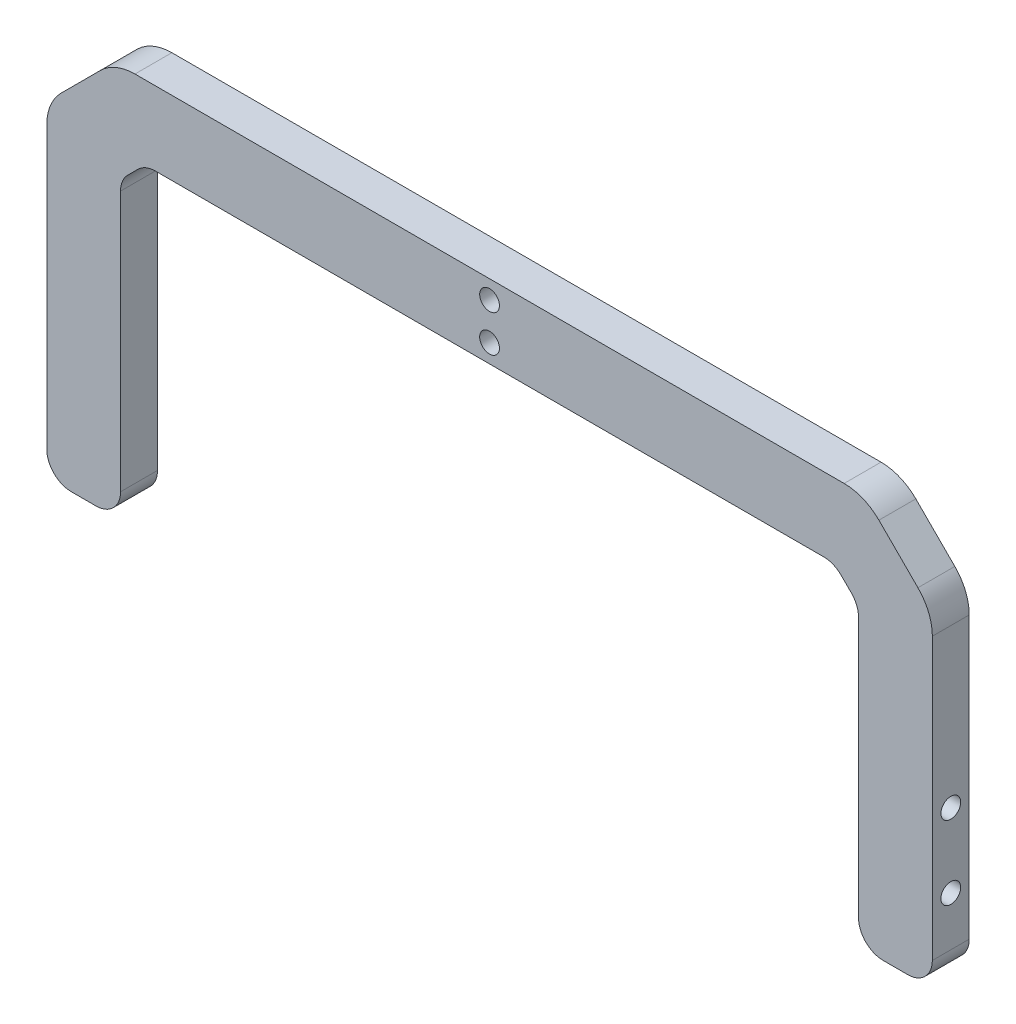
ISO-10303-21;
HEADER;
FILE_DESCRIPTION(('STEP AP214'),'2;1');
FILE_NAME('part.step','',(''),(''),'','','');
FILE_SCHEMA(('AUTOMOTIVE_DESIGN { 1 0 10303 214 1 1 1 1 }'));
ENDSEC;
DATA;
#1=APPLICATION_CONTEXT('core data for automotive mechanical design processes');
#2=APPLICATION_PROTOCOL_DEFINITION('international standard','automotive_design',2000,#1);
#3=PRODUCT_CONTEXT('',#1,'mechanical');
#4=PRODUCT('Part','Part','',(#3));
#5=PRODUCT_RELATED_PRODUCT_CATEGORY('part','',(#4));
#6=PRODUCT_DEFINITION_FORMATION('','',#4);
#7=PRODUCT_DEFINITION_CONTEXT('part definition',#1,'design');
#8=PRODUCT_DEFINITION('design','',#6,#7);
#9=PRODUCT_DEFINITION_SHAPE('','',#8);
#10=(LENGTH_UNIT() NAMED_UNIT(*) SI_UNIT(.MILLI.,.METRE.));
#11=(NAMED_UNIT(*) PLANE_ANGLE_UNIT() SI_UNIT($,.RADIAN.));
#12=(NAMED_UNIT(*) SI_UNIT($,.STERADIAN.) SOLID_ANGLE_UNIT());
#13=UNCERTAINTY_MEASURE_WITH_UNIT(LENGTH_MEASURE(1.E-05),#10,'distance_accuracy_value','');
#14=(GEOMETRIC_REPRESENTATION_CONTEXT(3) GLOBAL_UNCERTAINTY_ASSIGNED_CONTEXT((#13)) GLOBAL_UNIT_ASSIGNED_CONTEXT((#10,
#11,#12)) REPRESENTATION_CONTEXT('',''));
#15=CARTESIAN_POINT('',(0.,0.,0.));
#16=DIRECTION('',(0.,0.,1.));
#17=DIRECTION('',(1.,0.,0.));
#18=AXIS2_PLACEMENT_3D('',#15,#16,#17);
#19=CARTESIAN_POINT('',(0.,0.,9.525));
#20=DIRECTION('',(0.,0.,-1.));
#21=DIRECTION('',(-1.,0.,0.));
#22=AXIS2_PLACEMENT_3D('',#19,#20,#21);
#23=PLANE('',#22);
#24=CARTESIAN_POINT('',(0.,-4.7625,9.525));
#25=DIRECTION('',(0.,0.,1.));
#26=DIRECTION('',(1.,0.,0.));
#27=AXIS2_PLACEMENT_3D('',#24,#25,#26);
#28=CIRCLE('',#27,2.5527);
#29=CARTESIAN_POINT('',(2.5527,-4.7625,9.525));
#30=VERTEX_POINT('',#29);
#31=EDGE_CURVE('E239',#30,#30,#28,.T.);
#32=ORIENTED_EDGE('',*,*,#31,.F.);
#33=EDGE_LOOP('',(#32));
#34=FACE_BOUND('',#33,.T.);
#35=DIRECTION('',(-0.707106781186549,0.707106781186546,0.));
#36=VECTOR('',#35,1.);
#37=CARTESIAN_POINT('',(96.7907683632075,0.,9.525));
#38=LINE('',#37,#36);
#39=CARTESIAN_POINT('',(110.580256121069,-13.7894877578615,9.525));
#40=VERTEX_POINT('',#39);
#41=CARTESIAN_POINT('',(100.510512242138,-3.71974387893083,9.525));
#42=VERTEX_POINT('',#41);
#43=EDGE_CURVE('E279',#40,#42,#38,.T.);
#44=ORIENTED_EDGE('',*,*,#43,.T.);
#45=CARTESIAN_POINT('',(91.5302561210692,-12.7,9.525));
#46=DIRECTION('',(0.,0.,-1.));
#47=DIRECTION('',(-1.,0.,0.));
#48=AXIS2_PLACEMENT_3D('',#45,#46,#47);
#49=CIRCLE('',#48,12.7);
#50=CARTESIAN_POINT('',(91.5302561210692,0.,9.525));
#51=VERTEX_POINT('',#50);
#52=EDGE_CURVE('E416',#42,#51,#49,.F.);
#53=ORIENTED_EDGE('',*,*,#52,.T.);
#54=DIRECTION('',(-1.,0.,0.));
#55=VECTOR('',#54,1.);
#56=CARTESIAN_POINT('',(-96.7907683632075,0.,9.525));
#57=LINE('',#56,#55);
#58=CARTESIAN_POINT('',(-91.5302561210692,0.,9.525));
#59=VERTEX_POINT('',#58);
#60=EDGE_CURVE('E282',#51,#59,#57,.T.);
#61=ORIENTED_EDGE('',*,*,#60,.T.);
#62=CARTESIAN_POINT('',(-91.5302561210692,-12.7,9.525));
#63=DIRECTION('',(0.,0.,-1.));
#64=DIRECTION('',(-1.,0.,0.));
#65=AXIS2_PLACEMENT_3D('',#62,#63,#64);
#66=CIRCLE('',#65,12.7);
#67=CARTESIAN_POINT('',(-100.510512242138,-3.71974387893086,9.525));
#68=VERTEX_POINT('',#67);
#69=EDGE_CURVE('E411',#59,#68,#66,.F.);
#70=ORIENTED_EDGE('',*,*,#69,.T.);
#71=DIRECTION('',(-0.707106781186546,-0.707106781186549,0.));
#72=VECTOR('',#71,1.);
#73=CARTESIAN_POINT('',(-114.3,-17.5092316367925,9.525));
#74=LINE('',#73,#72);
#75=CARTESIAN_POINT('',(-110.580256121069,-13.7894877578617,9.525));
#76=VERTEX_POINT('',#75);
#77=EDGE_CURVE('E285',#68,#76,#74,.T.);
#78=ORIENTED_EDGE('',*,*,#77,.T.);
#79=CARTESIAN_POINT('',(-101.6,-22.7697438789308,9.525));
#80=DIRECTION('',(0.,0.,-1.));
#81=DIRECTION('',(-1.,0.,0.));
#82=AXIS2_PLACEMENT_3D('',#79,#80,#81);
#83=CIRCLE('',#82,12.7);
#84=CARTESIAN_POINT('',(-114.3,-22.7697438789308,9.525));
#85=VERTEX_POINT('',#84);
#86=EDGE_CURVE('E50',#76,#85,#83,.F.);
#87=ORIENTED_EDGE('',*,*,#86,.T.);
#88=DIRECTION('',(0.,-1.,0.));
#89=VECTOR('',#88,1.);
#90=CARTESIAN_POINT('',(-114.3,-101.6,9.525));
#91=LINE('',#90,#89);
#92=CARTESIAN_POINT('',(-114.3,-95.25,9.525));
#93=VERTEX_POINT('',#92);
#94=EDGE_CURVE('E252',#85,#93,#91,.T.);
#95=ORIENTED_EDGE('',*,*,#94,.T.);
#96=CARTESIAN_POINT('',(-107.95,-95.25,9.525));
#97=DIRECTION('',(0.,0.,-1.));
#98=DIRECTION('',(-1.,0.,0.));
#99=AXIS2_PLACEMENT_3D('',#96,#97,#98);
#100=CIRCLE('',#99,6.35);
#101=CARTESIAN_POINT('',(-107.95,-101.6,9.525));
#102=VERTEX_POINT('',#101);
#103=EDGE_CURVE('E338',#93,#102,#100,.F.);
#104=ORIENTED_EDGE('',*,*,#103,.T.);
#105=DIRECTION('',(1.,0.,0.));
#106=VECTOR('',#105,1.);
#107=CARTESIAN_POINT('',(-95.25,-101.6,9.525));
#108=LINE('',#107,#106);
#109=CARTESIAN_POINT('',(-101.6,-101.6,9.525));
#110=VERTEX_POINT('',#109);
#111=EDGE_CURVE('E254',#102,#110,#108,.T.);
#112=ORIENTED_EDGE('',*,*,#111,.T.);
#113=CARTESIAN_POINT('',(-101.6,-95.25,9.525));
#114=DIRECTION('',(0.,0.,-1.));
#115=DIRECTION('',(-1.,0.,0.));
#116=AXIS2_PLACEMENT_3D('',#113,#114,#115);
#117=CIRCLE('',#116,6.35);
#118=CARTESIAN_POINT('',(-95.25,-95.25,9.525));
#119=VERTEX_POINT('',#118);
#120=EDGE_CURVE('E336',#110,#119,#117,.F.);
#121=ORIENTED_EDGE('',*,*,#120,.T.);
#122=DIRECTION('',(0.,1.,0.));
#123=VECTOR('',#122,1.);
#124=CARTESIAN_POINT('',(-95.25,-25.4,9.525));
#125=LINE('',#124,#123);
#126=CARTESIAN_POINT('',(-95.25,-28.0302561210692,9.525));
#127=VERTEX_POINT('',#126);
#128=EDGE_CURVE('E258',#119,#127,#125,.T.);
#129=ORIENTED_EDGE('',*,*,#128,.T.);
#130=CARTESIAN_POINT('',(-88.9,-28.0302561210692,9.525));
#131=DIRECTION('',(0.,0.,-1.));
#132=DIRECTION('',(-1.,0.,0.));
#133=AXIS2_PLACEMENT_3D('',#130,#131,#132);
#134=CIRCLE('',#133,6.35);
#135=CARTESIAN_POINT('',(-93.3901280605346,-23.5401280605346,9.525));
#136=VERTEX_POINT('',#135);
#137=EDGE_CURVE('E391',#127,#136,#134,.T.);
#138=ORIENTED_EDGE('',*,*,#137,.T.);
#139=DIRECTION('',(0.707106781186547,0.707106781186548,0.));
#140=VECTOR('',#139,1.);
#141=CARTESIAN_POINT('',(-88.9000000000001,-19.05,9.525));
#142=LINE('',#141,#140);
#143=CARTESIAN_POINT('',(-90.7598719394655,-20.9098719394655,9.525));
#144=VERTEX_POINT('',#143);
#145=EDGE_CURVE('E261',#136,#144,#142,.T.);
#146=ORIENTED_EDGE('',*,*,#145,.T.);
#147=CARTESIAN_POINT('',(-86.2697438789309,-25.4,9.525));
#148=DIRECTION('',(0.,0.,-1.));
#149=DIRECTION('',(-1.,0.,0.));
#150=AXIS2_PLACEMENT_3D('',#147,#148,#149);
#151=CIRCLE('',#150,6.35);
#152=CARTESIAN_POINT('',(-86.2697438789309,-19.05,9.525));
#153=VERTEX_POINT('',#152);
#154=EDGE_CURVE('E387',#144,#153,#151,.T.);
#155=ORIENTED_EDGE('',*,*,#154,.T.);
#156=DIRECTION('',(1.,0.,0.));
#157=VECTOR('',#156,1.);
#158=CARTESIAN_POINT('',(88.9000000000001,-19.05,9.525));
#159=LINE('',#158,#157);
#160=CARTESIAN_POINT('',(86.269743878931,-19.05,9.525));
#161=VERTEX_POINT('',#160);
#162=EDGE_CURVE('E264',#153,#161,#159,.T.);
#163=ORIENTED_EDGE('',*,*,#162,.T.);
#164=CARTESIAN_POINT('',(86.269743878931,-25.4,9.525));
#165=DIRECTION('',(0.,0.,-1.));
#166=DIRECTION('',(-1.,0.,0.));
#167=AXIS2_PLACEMENT_3D('',#164,#165,#166);
#168=CIRCLE('',#167,6.35);
#169=CARTESIAN_POINT('',(90.7598719394655,-20.9098719394654,9.525));
#170=VERTEX_POINT('',#169);
#171=EDGE_CURVE('E383',#161,#170,#168,.T.);
#172=ORIENTED_EDGE('',*,*,#171,.T.);
#173=DIRECTION('',(0.707106781186549,-0.707106781186547,0.));
#174=VECTOR('',#173,1.);
#175=CARTESIAN_POINT('',(95.25,-25.3999999999999,9.525));
#176=LINE('',#175,#174);
#177=CARTESIAN_POINT('',(93.3901280605346,-23.5401280605345,9.525));
#178=VERTEX_POINT('',#177);
#179=EDGE_CURVE('E267',#170,#178,#176,.T.);
#180=ORIENTED_EDGE('',*,*,#179,.T.);
#181=CARTESIAN_POINT('',(88.9,-28.0302561210691,9.525));
#182=DIRECTION('',(0.,0.,-1.));
#183=DIRECTION('',(-1.,0.,0.));
#184=AXIS2_PLACEMENT_3D('',#181,#182,#183);
#185=CIRCLE('',#184,6.35);
#186=CARTESIAN_POINT('',(95.25,-28.0302561210691,9.525));
#187=VERTEX_POINT('',#186);
#188=EDGE_CURVE('E379',#178,#187,#185,.T.);
#189=ORIENTED_EDGE('',*,*,#188,.T.);
#190=DIRECTION('',(0.,-1.,0.));
#191=VECTOR('',#190,1.);
#192=CARTESIAN_POINT('',(95.25,-101.6,9.525));
#193=LINE('',#192,#191);
#194=CARTESIAN_POINT('',(95.25,-95.25,9.525));
#195=VERTEX_POINT('',#194);
#196=EDGE_CURVE('E270',#187,#195,#193,.T.);
#197=ORIENTED_EDGE('',*,*,#196,.T.);
#198=CARTESIAN_POINT('',(101.6,-95.25,9.525));
#199=DIRECTION('',(0.,0.,-1.));
#200=DIRECTION('',(-1.,0.,0.));
#201=AXIS2_PLACEMENT_3D('',#198,#199,#200);
#202=CIRCLE('',#201,6.35);
#203=CARTESIAN_POINT('',(101.6,-101.6,9.525));
#204=VERTEX_POINT('',#203);
#205=EDGE_CURVE('E340',#195,#204,#202,.F.);
#206=ORIENTED_EDGE('',*,*,#205,.T.);
#207=DIRECTION('',(1.,0.,0.));
#208=VECTOR('',#207,1.);
#209=CARTESIAN_POINT('',(114.3,-101.6,9.525));
#210=LINE('',#209,#208);
#211=CARTESIAN_POINT('',(107.95,-101.6,9.525));
#212=VERTEX_POINT('',#211);
#213=EDGE_CURVE('E273',#204,#212,#210,.T.);
#214=ORIENTED_EDGE('',*,*,#213,.T.);
#215=CARTESIAN_POINT('',(107.95,-95.25,9.525));
#216=DIRECTION('',(0.,0.,-1.));
#217=DIRECTION('',(-1.,0.,0.));
#218=AXIS2_PLACEMENT_3D('',#215,#216,#217);
#219=CIRCLE('',#218,6.35);
#220=CARTESIAN_POINT('',(114.3,-95.25,9.525));
#221=VERTEX_POINT('',#220);
#222=EDGE_CURVE('E342',#212,#221,#219,.F.);
#223=ORIENTED_EDGE('',*,*,#222,.T.);
#224=DIRECTION('',(0.,1.,0.));
#225=VECTOR('',#224,1.);
#226=CARTESIAN_POINT('',(114.3,-17.5092316367924,9.525));
#227=LINE('',#226,#225);
#228=CARTESIAN_POINT('',(114.3,-22.7697438789307,9.525));
#229=VERTEX_POINT('',#228);
#230=EDGE_CURVE('E276',#221,#229,#227,.T.);
#231=ORIENTED_EDGE('',*,*,#230,.T.);
#232=CARTESIAN_POINT('',(101.6,-22.7697438789307,9.525));
#233=DIRECTION('',(0.,0.,-1.));
#234=DIRECTION('',(-1.,0.,0.));
#235=AXIS2_PLACEMENT_3D('',#232,#233,#234);
#236=CIRCLE('',#235,12.7);
#237=EDGE_CURVE('E414',#229,#40,#236,.F.);
#238=ORIENTED_EDGE('',*,*,#237,.T.);
#239=EDGE_LOOP('',(#44,#53,#61,#70,#78,#87,#95,#104,#112,#121,#129,#138,#146,#155,#163,#172,
#180,#189,#197,#206,#214,#223,#231,#238));
#240=FACE_BOUND('',#239,.T.);
#241=CARTESIAN_POINT('',(0.,-14.2875,9.525));
#242=DIRECTION('',(0.,0.,1.));
#243=DIRECTION('',(1.,0.,0.));
#244=AXIS2_PLACEMENT_3D('',#241,#242,#243);
#245=CIRCLE('',#244,2.5527);
#246=CARTESIAN_POINT('',(2.5527,-14.2875,9.525));
#247=VERTEX_POINT('',#246);
#248=EDGE_CURVE('E245',#247,#247,#245,.T.);
#249=ORIENTED_EDGE('',*,*,#248,.F.);
#250=EDGE_LOOP('',(#249));
#251=FACE_BOUND('',#250,.T.);
#252=ADVANCED_FACE('F35',(#34,#240,#251),#23,.F.);
#253=CARTESIAN_POINT('',(-114.3,-101.6,9.525));
#254=DIRECTION('',(1.,0.,0.));
#255=DIRECTION('',(0.,1.,0.));
#256=AXIS2_PLACEMENT_3D('',#253,#254,#255);
#257=PLANE('',#256);
#258=CARTESIAN_POINT('',(-114.3,-82.55,4.7625));
#259=DIRECTION('',(-1.,0.,0.));
#260=DIRECTION('',(0.,0.,1.));
#261=AXIS2_PLACEMENT_3D('',#258,#259,#260);
#262=CIRCLE('',#261,2.55269999999999);
#263=CARTESIAN_POINT('',(-114.3,-82.55,7.31519999999999));
#264=VERTEX_POINT('',#263);
#265=EDGE_CURVE('E217',#264,#264,#262,.T.);
#266=ORIENTED_EDGE('',*,*,#265,.F.);
#267=EDGE_LOOP('',(#266));
#268=FACE_BOUND('',#267,.T.);
#269=CARTESIAN_POINT('',(-114.3,-63.5,4.7625));
#270=DIRECTION('',(-1.,0.,0.));
#271=DIRECTION('',(0.,0.,1.));
#272=AXIS2_PLACEMENT_3D('',#269,#270,#271);
#273=CIRCLE('',#272,2.55269999999999);
#274=CARTESIAN_POINT('',(-114.3,-63.5,7.31519999999999));
#275=VERTEX_POINT('',#274);
#276=EDGE_CURVE('E216',#275,#275,#273,.T.);
#277=ORIENTED_EDGE('',*,*,#276,.F.);
#278=EDGE_LOOP('',(#277));
#279=FACE_BOUND('',#278,.T.);
#280=ORIENTED_EDGE('',*,*,#94,.F.);
#281=DIRECTION('',(0.,0.,-1.));
#282=VECTOR('',#281,1.);
#283=CARTESIAN_POINT('',(-114.3,-22.7697438789308,9.525));
#284=LINE('',#283,#282);
#285=CARTESIAN_POINT('',(-114.3,-22.7697438789308,0.));
#286=VERTEX_POINT('',#285);
#287=EDGE_CURVE('E420',#85,#286,#284,.T.);
#288=ORIENTED_EDGE('',*,*,#287,.T.);
#289=DIRECTION('',(0.,-1.,0.));
#290=VECTOR('',#289,1.);
#291=CARTESIAN_POINT('',(-114.3,-101.6,0.));
#292=LINE('',#291,#290);
#293=CARTESIAN_POINT('',(-114.3,-95.25,0.));
#294=VERTEX_POINT('',#293);
#295=EDGE_CURVE('E251',#286,#294,#292,.T.);
#296=ORIENTED_EDGE('',*,*,#295,.T.);
#297=DIRECTION('',(0.,0.,-1.));
#298=VECTOR('',#297,1.);
#299=CARTESIAN_POINT('',(-114.3,-95.25,9.525));
#300=LINE('',#299,#298);
#301=EDGE_CURVE('E354',#294,#93,#300,.F.);
#302=ORIENTED_EDGE('',*,*,#301,.T.);
#303=EDGE_LOOP('',(#280,#288,#296,#302));
#304=FACE_BOUND('',#303,.T.);
#305=ADVANCED_FACE('F436',(#268,#279,#304),#257,.F.);
#306=CARTESIAN_POINT('',(-95.25,-101.6,9.525));
#307=DIRECTION('',(0.,1.,0.));
#308=DIRECTION('',(0.,0.,1.));
#309=AXIS2_PLACEMENT_3D('',#306,#307,#308);
#310=PLANE('',#309);
#311=ORIENTED_EDGE('',*,*,#111,.F.);
#312=DIRECTION('',(0.,0.,-1.));
#313=VECTOR('',#312,1.);
#314=CARTESIAN_POINT('',(-107.95,-101.6,9.525));
#315=LINE('',#314,#313);
#316=CARTESIAN_POINT('',(-107.95,-101.6,0.));
#317=VERTEX_POINT('',#316);
#318=EDGE_CURVE('E351',#102,#317,#315,.T.);
#319=ORIENTED_EDGE('',*,*,#318,.T.);
#320=DIRECTION('',(1.,0.,0.));
#321=VECTOR('',#320,1.);
#322=CARTESIAN_POINT('',(-95.25,-101.6,0.));
#323=LINE('',#322,#321);
#324=CARTESIAN_POINT('',(-101.6,-101.6,0.));
#325=VERTEX_POINT('',#324);
#326=EDGE_CURVE('E289',#317,#325,#323,.T.);
#327=ORIENTED_EDGE('',*,*,#326,.T.);
#328=DIRECTION('',(0.,0.,-1.));
#329=VECTOR('',#328,1.);
#330=CARTESIAN_POINT('',(-101.6,-101.6,9.525));
#331=LINE('',#330,#329);
#332=EDGE_CURVE('E349',#325,#110,#331,.F.);
#333=ORIENTED_EDGE('',*,*,#332,.T.);
#334=EDGE_LOOP('',(#311,#319,#327,#333));
#335=FACE_BOUND('',#334,.T.);
#336=ADVANCED_FACE('F445',(#335),#310,.F.);
#337=CARTESIAN_POINT('',(-95.25,-25.4,9.525));
#338=DIRECTION('',(-1.,0.,0.));
#339=DIRECTION('',(0.,-1.,0.));
#340=AXIS2_PLACEMENT_3D('',#337,#338,#339);
#341=PLANE('',#340);
#342=ORIENTED_EDGE('',*,*,#128,.F.);
#343=DIRECTION('',(0.,0.,-1.));
#344=VECTOR('',#343,1.);
#345=CARTESIAN_POINT('',(-95.25,-95.25,9.525));
#346=LINE('',#345,#344);
#347=CARTESIAN_POINT('',(-95.25,-95.25,0.));
#348=VERTEX_POINT('',#347);
#349=EDGE_CURVE('E359',#119,#348,#346,.T.);
#350=ORIENTED_EDGE('',*,*,#349,.T.);
#351=DIRECTION('',(0.,1.,0.));
#352=VECTOR('',#351,1.);
#353=CARTESIAN_POINT('',(-95.25,-25.4,0.));
#354=LINE('',#353,#352);
#355=CARTESIAN_POINT('',(-95.25,-28.0302561210692,0.));
#356=VERTEX_POINT('',#355);
#357=EDGE_CURVE('E292',#348,#356,#354,.T.);
#358=ORIENTED_EDGE('',*,*,#357,.T.);
#359=DIRECTION('',(0.,0.,-1.));
#360=VECTOR('',#359,1.);
#361=CARTESIAN_POINT('',(-95.25,-28.0302561210692,9.525));
#362=LINE('',#361,#360);
#363=EDGE_CURVE('E357',#356,#127,#362,.F.);
#364=ORIENTED_EDGE('',*,*,#363,.T.);
#365=EDGE_LOOP('',(#342,#350,#358,#364));
#366=FACE_BOUND('',#365,.T.);
#367=ADVANCED_FACE('F456',(#366),#341,.F.);
#368=CARTESIAN_POINT('',(-88.9000000000001,-19.05,9.525));
#369=DIRECTION('',(-0.707106781186548,0.707106781186547,0.));
#370=DIRECTION('',(-0.707106781186547,-0.707106781186548,0.));
#371=AXIS2_PLACEMENT_3D('',#368,#369,#370);
#372=PLANE('',#371);
#373=DIRECTION('',(0.707106781186547,0.707106781186548,0.));
#374=VECTOR('',#373,1.);
#375=CARTESIAN_POINT('',(-88.9000000000001,-19.05,0.));
#376=LINE('',#375,#374);
#377=CARTESIAN_POINT('',(-93.3901280605346,-23.5401280605346,0.));
#378=VERTEX_POINT('',#377);
#379=CARTESIAN_POINT('',(-90.7598719394655,-20.9098719394655,0.));
#380=VERTEX_POINT('',#379);
#381=EDGE_CURVE('E295',#378,#380,#376,.T.);
#382=ORIENTED_EDGE('',*,*,#381,.T.);
#383=DIRECTION('',(0.,0.,-1.));
#384=VECTOR('',#383,1.);
#385=CARTESIAN_POINT('',(-90.7598719394655,-20.9098719394655,9.525));
#386=LINE('',#385,#384);
#387=EDGE_CURVE('E375',#380,#144,#386,.F.);
#388=ORIENTED_EDGE('',*,*,#387,.T.);
#389=ORIENTED_EDGE('',*,*,#145,.F.);
#390=DIRECTION('',(0.,0.,-1.));
#391=VECTOR('',#390,1.);
#392=CARTESIAN_POINT('',(-93.3901280605346,-23.5401280605346,0.));
#393=LINE('',#392,#391);
#394=EDGE_CURVE('E372',#136,#378,#393,.T.);
#395=ORIENTED_EDGE('',*,*,#394,.T.);
#396=EDGE_LOOP('',(#382,#388,#389,#395));
#397=FACE_BOUND('',#396,.T.);
#398=ADVANCED_FACE('F464',(#397),#372,.F.);
#399=CARTESIAN_POINT('',(88.9000000000001,-19.05,9.525));
#400=DIRECTION('',(0.,1.,0.));
#401=DIRECTION('',(-1.,0.,0.));
#402=AXIS2_PLACEMENT_3D('',#399,#400,#401);
#403=PLANE('',#402);
#404=DIRECTION('',(1.,0.,0.));
#405=VECTOR('',#404,1.);
#406=CARTESIAN_POINT('',(88.9000000000001,-19.05,0.));
#407=LINE('',#406,#405);
#408=CARTESIAN_POINT('',(-86.2697438789309,-19.05,0.));
#409=VERTEX_POINT('',#408);
#410=CARTESIAN_POINT('',(86.269743878931,-19.05,0.));
#411=VERTEX_POINT('',#410);
#412=EDGE_CURVE('E298',#409,#411,#407,.T.);
#413=ORIENTED_EDGE('',*,*,#412,.T.);
#414=DIRECTION('',(0.,0.,-1.));
#415=VECTOR('',#414,1.);
#416=CARTESIAN_POINT('',(86.269743878931,-19.05,9.525));
#417=LINE('',#416,#415);
#418=EDGE_CURVE('E370',#411,#161,#417,.F.);
#419=ORIENTED_EDGE('',*,*,#418,.T.);
#420=ORIENTED_EDGE('',*,*,#162,.F.);
#421=DIRECTION('',(0.,0.,-1.));
#422=VECTOR('',#421,1.);
#423=CARTESIAN_POINT('',(-86.2697438789309,-19.05,0.));
#424=LINE('',#423,#422);
#425=EDGE_CURVE('E367',#153,#409,#424,.T.);
#426=ORIENTED_EDGE('',*,*,#425,.T.);
#427=EDGE_LOOP('',(#413,#419,#420,#426));
#428=FACE_BOUND('',#427,.T.);
#429=ADVANCED_FACE('F473',(#428),#403,.F.);
#430=CARTESIAN_POINT('',(95.25,-25.3999999999999,9.525));
#431=DIRECTION('',(0.707106781186547,0.707106781186549,0.));
#432=DIRECTION('',(-0.707106781186549,0.707106781186547,0.));
#433=AXIS2_PLACEMENT_3D('',#430,#431,#432);
#434=PLANE('',#433);
#435=DIRECTION('',(0.707106781186549,-0.707106781186547,0.));
#436=VECTOR('',#435,1.);
#437=CARTESIAN_POINT('',(95.25,-25.3999999999999,0.));
#438=LINE('',#437,#436);
#439=CARTESIAN_POINT('',(90.7598719394655,-20.9098719394654,0.));
#440=VERTEX_POINT('',#439);
#441=CARTESIAN_POINT('',(93.3901280605346,-23.5401280605345,0.));
#442=VERTEX_POINT('',#441);
#443=EDGE_CURVE('E301',#440,#442,#438,.T.);
#444=ORIENTED_EDGE('',*,*,#443,.T.);
#445=DIRECTION('',(0.,0.,-1.));
#446=VECTOR('',#445,1.);
#447=CARTESIAN_POINT('',(93.3901280605346,-23.5401280605345,9.525));
#448=LINE('',#447,#446);
#449=EDGE_CURVE('E365',#442,#178,#448,.F.);
#450=ORIENTED_EDGE('',*,*,#449,.T.);
#451=ORIENTED_EDGE('',*,*,#179,.F.);
#452=DIRECTION('',(0.,0.,-1.));
#453=VECTOR('',#452,1.);
#454=CARTESIAN_POINT('',(90.7598719394655,-20.9098719394654,0.));
#455=LINE('',#454,#453);
#456=EDGE_CURVE('E362',#170,#440,#455,.T.);
#457=ORIENTED_EDGE('',*,*,#456,.T.);
#458=EDGE_LOOP('',(#444,#450,#451,#457));
#459=FACE_BOUND('',#458,.T.);
#460=ADVANCED_FACE('F482',(#459),#434,.F.);
#461=CARTESIAN_POINT('',(95.25,-101.6,9.525));
#462=DIRECTION('',(1.,0.,0.));
#463=DIRECTION('',(0.,1.,0.));
#464=AXIS2_PLACEMENT_3D('',#461,#462,#463);
#465=PLANE('',#464);
#466=DIRECTION('',(0.,-1.,0.));
#467=VECTOR('',#466,1.);
#468=CARTESIAN_POINT('',(95.25,-101.6,0.));
#469=LINE('',#468,#467);
#470=CARTESIAN_POINT('',(95.25,-28.0302561210691,0.));
#471=VERTEX_POINT('',#470);
#472=CARTESIAN_POINT('',(95.25,-95.25,0.));
#473=VERTEX_POINT('',#472);
#474=EDGE_CURVE('E304',#471,#473,#469,.T.);
#475=ORIENTED_EDGE('',*,*,#474,.T.);
#476=DIRECTION('',(0.,0.,-1.));
#477=VECTOR('',#476,1.);
#478=CARTESIAN_POINT('',(95.25,-95.25,9.525));
#479=LINE('',#478,#477);
#480=EDGE_CURVE('E347',#473,#195,#479,.F.);
#481=ORIENTED_EDGE('',*,*,#480,.T.);
#482=ORIENTED_EDGE('',*,*,#196,.F.);
#483=DIRECTION('',(0.,0.,-1.));
#484=VECTOR('',#483,1.);
#485=CARTESIAN_POINT('',(95.25,-28.0302561210691,0.));
#486=LINE('',#485,#484);
#487=EDGE_CURVE('E344',#187,#471,#486,.T.);
#488=ORIENTED_EDGE('',*,*,#487,.T.);
#489=EDGE_LOOP('',(#475,#481,#482,#488));
#490=FACE_BOUND('',#489,.T.);
#491=ADVANCED_FACE('F491',(#490),#465,.F.);
#492=CARTESIAN_POINT('',(114.3,-101.6,9.525));
#493=DIRECTION('',(0.,1.,0.));
#494=DIRECTION('',(0.,0.,1.));
#495=AXIS2_PLACEMENT_3D('',#492,#493,#494);
#496=PLANE('',#495);
#497=DIRECTION('',(1.,0.,0.));
#498=VECTOR('',#497,1.);
#499=CARTESIAN_POINT('',(114.3,-101.6,0.));
#500=LINE('',#499,#498);
#501=CARTESIAN_POINT('',(101.6,-101.6,0.));
#502=VERTEX_POINT('',#501);
#503=CARTESIAN_POINT('',(107.95,-101.6,0.));
#504=VERTEX_POINT('',#503);
#505=EDGE_CURVE('E307',#502,#504,#500,.T.);
#506=ORIENTED_EDGE('',*,*,#505,.T.);
#507=DIRECTION('',(0.,0.,-1.));
#508=VECTOR('',#507,1.);
#509=CARTESIAN_POINT('',(107.95,-101.6,9.525));
#510=LINE('',#509,#508);
#511=EDGE_CURVE('E334',#504,#212,#510,.F.);
#512=ORIENTED_EDGE('',*,*,#511,.T.);
#513=ORIENTED_EDGE('',*,*,#213,.F.);
#514=DIRECTION('',(0.,0.,-1.));
#515=VECTOR('',#514,1.);
#516=CARTESIAN_POINT('',(101.6,-101.6,9.525));
#517=LINE('',#516,#515);
#518=EDGE_CURVE('E331',#204,#502,#517,.T.);
#519=ORIENTED_EDGE('',*,*,#518,.T.);
#520=EDGE_LOOP('',(#506,#512,#513,#519));
#521=FACE_BOUND('',#520,.T.);
#522=ADVANCED_FACE('F500',(#521),#496,.F.);
#523=CARTESIAN_POINT('',(114.3,-17.5092316367924,9.525));
#524=DIRECTION('',(-1.,0.,0.));
#525=DIRECTION('',(0.,0.,1.));
#526=AXIS2_PLACEMENT_3D('',#523,#524,#525);
#527=PLANE('',#526);
#528=CARTESIAN_POINT('',(114.3,-82.55,4.7625));
#529=DIRECTION('',(1.,0.,0.));
#530=DIRECTION('',(0.,0.,-1.));
#531=AXIS2_PLACEMENT_3D('',#528,#529,#530);
#532=CIRCLE('',#531,2.55269999999999);
#533=CARTESIAN_POINT('',(114.3,-82.55,2.20980000000001));
#534=VERTEX_POINT('',#533);
#535=EDGE_CURVE('E227',#534,#534,#532,.T.);
#536=ORIENTED_EDGE('',*,*,#535,.F.);
#537=EDGE_LOOP('',(#536));
#538=FACE_BOUND('',#537,.T.);
#539=CARTESIAN_POINT('',(114.3,-63.5,4.7625));
#540=DIRECTION('',(1.,0.,0.));
#541=DIRECTION('',(0.,0.,-1.));
#542=AXIS2_PLACEMENT_3D('',#539,#540,#541);
#543=CIRCLE('',#542,2.55269999999999);
#544=CARTESIAN_POINT('',(114.3,-63.5,2.20980000000001));
#545=VERTEX_POINT('',#544);
#546=EDGE_CURVE('E233',#545,#545,#543,.T.);
#547=ORIENTED_EDGE('',*,*,#546,.F.);
#548=EDGE_LOOP('',(#547));
#549=FACE_BOUND('',#548,.T.);
#550=DIRECTION('',(0.,1.,0.));
#551=VECTOR('',#550,1.);
#552=CARTESIAN_POINT('',(114.3,-17.5092316367924,0.));
#553=LINE('',#552,#551);
#554=CARTESIAN_POINT('',(114.3,-95.25,0.));
#555=VERTEX_POINT('',#554);
#556=CARTESIAN_POINT('',(114.3,-22.7697438789307,0.));
#557=VERTEX_POINT('',#556);
#558=EDGE_CURVE('E310',#555,#557,#553,.T.);
#559=ORIENTED_EDGE('',*,*,#558,.T.);
#560=DIRECTION('',(0.,0.,-1.));
#561=VECTOR('',#560,1.);
#562=CARTESIAN_POINT('',(114.3,-22.7697438789307,9.525));
#563=LINE('',#562,#561);
#564=EDGE_CURVE('E418',#557,#229,#563,.F.);
#565=ORIENTED_EDGE('',*,*,#564,.T.);
#566=ORIENTED_EDGE('',*,*,#230,.F.);
#567=DIRECTION('',(0.,0.,-1.));
#568=VECTOR('',#567,1.);
#569=CARTESIAN_POINT('',(114.3,-95.25,9.525));
#570=LINE('',#569,#568);
#571=EDGE_CURVE('E287',#221,#555,#570,.T.);
#572=ORIENTED_EDGE('',*,*,#571,.T.);
#573=EDGE_LOOP('',(#559,#565,#566,#572));
#574=FACE_BOUND('',#573,.T.);
#575=ADVANCED_FACE('F509',(#538,#549,#574),#527,.F.);
#576=CARTESIAN_POINT('',(96.7907683632075,0.,9.525));
#577=DIRECTION('',(-0.707106781186546,-0.707106781186549,0.));
#578=DIRECTION('',(0.707106781186549,-0.707106781186546,0.));
#579=AXIS2_PLACEMENT_3D('',#576,#577,#578);
#580=PLANE('',#579);
#581=DIRECTION('',(-0.707106781186549,0.707106781186546,0.));
#582=VECTOR('',#581,1.);
#583=CARTESIAN_POINT('',(96.7907683632075,0.,0.));
#584=LINE('',#583,#582);
#585=CARTESIAN_POINT('',(110.580256121069,-13.7894877578615,0.));
#586=VERTEX_POINT('',#585);
#587=CARTESIAN_POINT('',(100.510512242138,-3.71974387893083,0.));
#588=VERTEX_POINT('',#587);
#589=EDGE_CURVE('E313',#586,#588,#584,.T.);
#590=ORIENTED_EDGE('',*,*,#589,.T.);
#591=DIRECTION('',(0.,0.,-1.));
#592=VECTOR('',#591,1.);
#593=CARTESIAN_POINT('',(100.510512242138,-3.71974387893083,9.525));
#594=LINE('',#593,#592);
#595=EDGE_CURVE('E409',#588,#42,#594,.F.);
#596=ORIENTED_EDGE('',*,*,#595,.T.);
#597=ORIENTED_EDGE('',*,*,#43,.F.);
#598=DIRECTION('',(0.,0.,-1.));
#599=VECTOR('',#598,1.);
#600=CARTESIAN_POINT('',(110.580256121069,-13.7894877578615,9.525));
#601=LINE('',#600,#599);
#602=EDGE_CURVE('E406',#40,#586,#601,.T.);
#603=ORIENTED_EDGE('',*,*,#602,.T.);
#604=EDGE_LOOP('',(#590,#596,#597,#603));
#605=FACE_BOUND('',#604,.T.);
#606=ADVANCED_FACE('F518',(#605),#580,.F.);
#607=CARTESIAN_POINT('',(-96.7907683632075,0.,9.525));
#608=DIRECTION('',(0.,-1.,0.));
#609=DIRECTION('',(1.,0.,0.));
#610=AXIS2_PLACEMENT_3D('',#607,#608,#609);
#611=PLANE('',#610);
#612=ORIENTED_EDGE('',*,*,#60,.F.);
#613=DIRECTION('',(0.,0.,-1.));
#614=VECTOR('',#613,1.);
#615=CARTESIAN_POINT('',(91.5302561210692,0.,9.525));
#616=LINE('',#615,#614);
#617=CARTESIAN_POINT('',(91.5302561210692,0.,0.));
#618=VERTEX_POINT('',#617);
#619=EDGE_CURVE('E395',#51,#618,#616,.T.);
#620=ORIENTED_EDGE('',*,*,#619,.T.);
#621=DIRECTION('',(-1.,0.,0.));
#622=VECTOR('',#621,1.);
#623=CARTESIAN_POINT('',(-96.7907683632075,0.,0.));
#624=LINE('',#623,#622);
#625=CARTESIAN_POINT('',(-91.5302561210692,0.,0.));
#626=VERTEX_POINT('',#625);
#627=EDGE_CURVE('E316',#618,#626,#624,.T.);
#628=ORIENTED_EDGE('',*,*,#627,.T.);
#629=DIRECTION('',(0.,0.,-1.));
#630=VECTOR('',#629,1.);
#631=CARTESIAN_POINT('',(-91.5302561210692,0.,9.525));
#632=LINE('',#631,#630);
#633=EDGE_CURVE('E393',#626,#59,#632,.F.);
#634=ORIENTED_EDGE('',*,*,#633,.T.);
#635=EDGE_LOOP('',(#612,#620,#628,#634));
#636=FACE_BOUND('',#635,.T.);
#637=ADVANCED_FACE('F526',(#636),#611,.F.);
#638=CARTESIAN_POINT('',(-114.3,-17.5092316367925,9.525));
#639=DIRECTION('',(0.707106781186549,-0.707106781186546,0.));
#640=DIRECTION('',(0.707106781186546,0.707106781186549,0.));
#641=AXIS2_PLACEMENT_3D('',#638,#639,#640);
#642=PLANE('',#641);
#643=DIRECTION('',(-0.707106781186546,-0.707106781186549,0.));
#644=VECTOR('',#643,1.);
#645=CARTESIAN_POINT('',(-114.3,-17.5092316367925,0.));
#646=LINE('',#645,#644);
#647=CARTESIAN_POINT('',(-100.510512242138,-3.71974387893086,0.));
#648=VERTEX_POINT('',#647);
#649=CARTESIAN_POINT('',(-110.580256121069,-13.7894877578617,0.));
#650=VERTEX_POINT('',#649);
#651=EDGE_CURVE('E255',#648,#650,#646,.T.);
#652=ORIENTED_EDGE('',*,*,#651,.T.);
#653=DIRECTION('',(0.,0.,-1.));
#654=VECTOR('',#653,1.);
#655=CARTESIAN_POINT('',(-110.580256121069,-13.7894877578617,9.525));
#656=LINE('',#655,#654);
#657=EDGE_CURVE('E11',#650,#76,#656,.F.);
#658=ORIENTED_EDGE('',*,*,#657,.T.);
#659=ORIENTED_EDGE('',*,*,#77,.F.);
#660=DIRECTION('',(0.,0.,-1.));
#661=VECTOR('',#660,1.);
#662=CARTESIAN_POINT('',(-100.510512242138,-3.71974387893086,9.525));
#663=LINE('',#662,#661);
#664=EDGE_CURVE('E43',#68,#648,#663,.T.);
#665=ORIENTED_EDGE('',*,*,#664,.T.);
#666=EDGE_LOOP('',(#652,#658,#659,#665));
#667=FACE_BOUND('',#666,.T.);
#668=ADVANCED_FACE('F425',(#667),#642,.F.);
#669=CARTESIAN_POINT('',(0.,0.,0.));
#670=DIRECTION('',(0.,0.,-1.));
#671=DIRECTION('',(-1.,0.,0.));
#672=AXIS2_PLACEMENT_3D('',#669,#670,#671);
#673=PLANE('',#672);
#674=CARTESIAN_POINT('',(0.,-4.7625,0.));
#675=DIRECTION('',(0.,0.,1.));
#676=DIRECTION('',(1.,0.,0.));
#677=AXIS2_PLACEMENT_3D('',#674,#675,#676);
#678=CIRCLE('',#677,2.5527);
#679=CARTESIAN_POINT('',(2.5527,-4.7625,0.));
#680=VERTEX_POINT('',#679);
#681=EDGE_CURVE('E242',#680,#680,#678,.T.);
#682=ORIENTED_EDGE('',*,*,#681,.T.);
#683=EDGE_LOOP('',(#682));
#684=FACE_BOUND('',#683,.T.);
#685=CARTESIAN_POINT('',(0.,-14.2875,0.));
#686=DIRECTION('',(0.,0.,1.));
#687=DIRECTION('',(1.,0.,0.));
#688=AXIS2_PLACEMENT_3D('',#685,#686,#687);
#689=CIRCLE('',#688,2.5527);
#690=CARTESIAN_POINT('',(2.5527,-14.2875,0.));
#691=VERTEX_POINT('',#690);
#692=EDGE_CURVE('E248',#691,#691,#689,.T.);
#693=ORIENTED_EDGE('',*,*,#692,.T.);
#694=EDGE_LOOP('',(#693));
#695=FACE_BOUND('',#694,.T.);
#696=ORIENTED_EDGE('',*,*,#627,.F.);
#697=CARTESIAN_POINT('',(91.5302561210692,-12.7,0.));
#698=DIRECTION('',(0.,0.,-1.));
#699=DIRECTION('',(-1.,0.,0.));
#700=AXIS2_PLACEMENT_3D('',#697,#698,#699);
#701=CIRCLE('',#700,12.7);
#702=EDGE_CURVE('E404',#618,#588,#701,.T.);
#703=ORIENTED_EDGE('',*,*,#702,.T.);
#704=ORIENTED_EDGE('',*,*,#589,.F.);
#705=CARTESIAN_POINT('',(101.6,-22.7697438789307,0.));
#706=DIRECTION('',(0.,0.,-1.));
#707=DIRECTION('',(-1.,0.,0.));
#708=AXIS2_PLACEMENT_3D('',#705,#706,#707);
#709=CIRCLE('',#708,12.7);
#710=EDGE_CURVE('E402',#586,#557,#709,.T.);
#711=ORIENTED_EDGE('',*,*,#710,.T.);
#712=ORIENTED_EDGE('',*,*,#558,.F.);
#713=CARTESIAN_POINT('',(107.95,-95.25,0.));
#714=DIRECTION('',(0.,0.,-1.));
#715=DIRECTION('',(-1.,0.,0.));
#716=AXIS2_PLACEMENT_3D('',#713,#714,#715);
#717=CIRCLE('',#716,6.35);
#718=EDGE_CURVE('E329',#555,#504,#717,.T.);
#719=ORIENTED_EDGE('',*,*,#718,.T.);
#720=ORIENTED_EDGE('',*,*,#505,.F.);
#721=CARTESIAN_POINT('',(101.6,-95.25,0.));
#722=DIRECTION('',(0.,0.,-1.));
#723=DIRECTION('',(-1.,0.,0.));
#724=AXIS2_PLACEMENT_3D('',#721,#722,#723);
#725=CIRCLE('',#724,6.35);
#726=EDGE_CURVE('E327',#502,#473,#725,.T.);
#727=ORIENTED_EDGE('',*,*,#726,.T.);
#728=ORIENTED_EDGE('',*,*,#474,.F.);
#729=CARTESIAN_POINT('',(88.9,-28.0302561210691,0.));
#730=DIRECTION('',(0.,0.,-1.));
#731=DIRECTION('',(-1.,0.,0.));
#732=AXIS2_PLACEMENT_3D('',#729,#730,#731);
#733=CIRCLE('',#732,6.35);
#734=EDGE_CURVE('E377',#471,#442,#733,.F.);
#735=ORIENTED_EDGE('',*,*,#734,.T.);
#736=ORIENTED_EDGE('',*,*,#443,.F.);
#737=CARTESIAN_POINT('',(86.269743878931,-25.4,0.));
#738=DIRECTION('',(0.,0.,-1.));
#739=DIRECTION('',(-1.,0.,0.));
#740=AXIS2_PLACEMENT_3D('',#737,#738,#739);
#741=CIRCLE('',#740,6.35);
#742=EDGE_CURVE('E381',#440,#411,#741,.F.);
#743=ORIENTED_EDGE('',*,*,#742,.T.);
#744=ORIENTED_EDGE('',*,*,#412,.F.);
#745=CARTESIAN_POINT('',(-86.2697438789309,-25.4,0.));
#746=DIRECTION('',(0.,0.,-1.));
#747=DIRECTION('',(-1.,0.,0.));
#748=AXIS2_PLACEMENT_3D('',#745,#746,#747);
#749=CIRCLE('',#748,6.35);
#750=EDGE_CURVE('E385',#409,#380,#749,.F.);
#751=ORIENTED_EDGE('',*,*,#750,.T.);
#752=ORIENTED_EDGE('',*,*,#381,.F.);
#753=CARTESIAN_POINT('',(-88.9,-28.0302561210692,0.));
#754=DIRECTION('',(0.,0.,-1.));
#755=DIRECTION('',(-1.,0.,0.));
#756=AXIS2_PLACEMENT_3D('',#753,#754,#755);
#757=CIRCLE('',#756,6.35);
#758=EDGE_CURVE('E389',#378,#356,#757,.F.);
#759=ORIENTED_EDGE('',*,*,#758,.T.);
#760=ORIENTED_EDGE('',*,*,#357,.F.);
#761=CARTESIAN_POINT('',(-101.6,-95.25,0.));
#762=DIRECTION('',(0.,0.,-1.));
#763=DIRECTION('',(-1.,0.,0.));
#764=AXIS2_PLACEMENT_3D('',#761,#762,#763);
#765=CIRCLE('',#764,6.35);
#766=EDGE_CURVE('E322',#348,#325,#765,.T.);
#767=ORIENTED_EDGE('',*,*,#766,.T.);
#768=ORIENTED_EDGE('',*,*,#326,.F.);
#769=CARTESIAN_POINT('',(-107.95,-95.25,0.));
#770=DIRECTION('',(0.,0.,-1.));
#771=DIRECTION('',(-1.,0.,0.));
#772=AXIS2_PLACEMENT_3D('',#769,#770,#771);
#773=CIRCLE('',#772,6.35);
#774=EDGE_CURVE('E324',#317,#294,#773,.T.);
#775=ORIENTED_EDGE('',*,*,#774,.T.);
#776=ORIENTED_EDGE('',*,*,#295,.F.);
#777=CARTESIAN_POINT('',(-101.6,-22.7697438789308,0.));
#778=DIRECTION('',(0.,0.,-1.));
#779=DIRECTION('',(-1.,0.,0.));
#780=AXIS2_PLACEMENT_3D('',#777,#778,#779);
#781=CIRCLE('',#780,12.7);
#782=EDGE_CURVE('E400',#286,#650,#781,.T.);
#783=ORIENTED_EDGE('',*,*,#782,.T.);
#784=ORIENTED_EDGE('',*,*,#651,.F.);
#785=CARTESIAN_POINT('',(-91.5302561210692,-12.7,0.));
#786=DIRECTION('',(0.,0.,-1.));
#787=DIRECTION('',(-1.,0.,0.));
#788=AXIS2_PLACEMENT_3D('',#785,#786,#787);
#789=CIRCLE('',#788,12.7);
#790=EDGE_CURVE('E398',#648,#626,#789,.T.);
#791=ORIENTED_EDGE('',*,*,#790,.T.);
#792=EDGE_LOOP('',(#696,#703,#704,#711,#712,#719,#720,#727,#728,#735,#736,#743,#744,#751,#752,
#759,#760,#767,#768,#775,#776,#783,#784,#791));
#793=FACE_BOUND('',#792,.T.);
#794=ADVANCED_FACE('F430',(#684,#695,#793),#673,.T.);
#795=CARTESIAN_POINT('',(107.95,-95.25,9.525));
#796=DIRECTION('',(0.,0.,-1.));
#797=DIRECTION('',(-1.,0.,0.));
#798=AXIS2_PLACEMENT_3D('',#795,#796,#797);
#799=CYLINDRICAL_SURFACE('',#798,6.35);
#800=ORIENTED_EDGE('',*,*,#222,.F.);
#801=ORIENTED_EDGE('',*,*,#511,.F.);
#802=ORIENTED_EDGE('',*,*,#718,.F.);
#803=ORIENTED_EDGE('',*,*,#571,.F.);
#804=EDGE_LOOP('',(#800,#801,#802,#803));
#805=FACE_BOUND('',#804,.T.);
#806=ADVANCED_FACE('F504',(#805),#799,.T.);
#807=CARTESIAN_POINT('',(101.6,-95.25,9.525));
#808=DIRECTION('',(0.,0.,-1.));
#809=DIRECTION('',(-1.,0.,0.));
#810=AXIS2_PLACEMENT_3D('',#807,#808,#809);
#811=CYLINDRICAL_SURFACE('',#810,6.35);
#812=ORIENTED_EDGE('',*,*,#205,.F.);
#813=ORIENTED_EDGE('',*,*,#480,.F.);
#814=ORIENTED_EDGE('',*,*,#726,.F.);
#815=ORIENTED_EDGE('',*,*,#518,.F.);
#816=EDGE_LOOP('',(#812,#813,#814,#815));
#817=FACE_BOUND('',#816,.T.);
#818=ADVANCED_FACE('F495',(#817),#811,.T.);
#819=CARTESIAN_POINT('',(-107.95,-95.25,9.525));
#820=DIRECTION('',(0.,0.,-1.));
#821=DIRECTION('',(-1.,0.,0.));
#822=AXIS2_PLACEMENT_3D('',#819,#820,#821);
#823=CYLINDRICAL_SURFACE('',#822,6.35);
#824=ORIENTED_EDGE('',*,*,#103,.F.);
#825=ORIENTED_EDGE('',*,*,#301,.F.);
#826=ORIENTED_EDGE('',*,*,#774,.F.);
#827=ORIENTED_EDGE('',*,*,#318,.F.);
#828=EDGE_LOOP('',(#824,#825,#826,#827));
#829=FACE_BOUND('',#828,.T.);
#830=ADVANCED_FACE('F448',(#829),#823,.T.);
#831=CARTESIAN_POINT('',(-101.6,-95.25,9.525));
#832=DIRECTION('',(0.,0.,-1.));
#833=DIRECTION('',(-1.,0.,0.));
#834=AXIS2_PLACEMENT_3D('',#831,#832,#833);
#835=CYLINDRICAL_SURFACE('',#834,6.35);
#836=ORIENTED_EDGE('',*,*,#120,.F.);
#837=ORIENTED_EDGE('',*,*,#332,.F.);
#838=ORIENTED_EDGE('',*,*,#766,.F.);
#839=ORIENTED_EDGE('',*,*,#349,.F.);
#840=EDGE_LOOP('',(#836,#837,#838,#839));
#841=FACE_BOUND('',#840,.T.);
#842=ADVANCED_FACE('F451',(#841),#835,.T.);
#843=CARTESIAN_POINT('',(88.9,-28.0302561210691,9.525));
#844=DIRECTION('',(0.,0.,1.));
#845=DIRECTION('',(1.,0.,0.));
#846=AXIS2_PLACEMENT_3D('',#843,#844,#845);
#847=CYLINDRICAL_SURFACE('',#846,6.35);
#848=ORIENTED_EDGE('',*,*,#188,.F.);
#849=ORIENTED_EDGE('',*,*,#449,.F.);
#850=ORIENTED_EDGE('',*,*,#734,.F.);
#851=ORIENTED_EDGE('',*,*,#487,.F.);
#852=EDGE_LOOP('',(#848,#849,#850,#851));
#853=FACE_BOUND('',#852,.T.);
#854=ADVANCED_FACE('F486',(#853),#847,.F.);
#855=CARTESIAN_POINT('',(86.269743878931,-25.4,9.525));
#856=DIRECTION('',(0.,0.,1.));
#857=DIRECTION('',(1.,0.,0.));
#858=AXIS2_PLACEMENT_3D('',#855,#856,#857);
#859=CYLINDRICAL_SURFACE('',#858,6.35);
#860=ORIENTED_EDGE('',*,*,#171,.F.);
#861=ORIENTED_EDGE('',*,*,#418,.F.);
#862=ORIENTED_EDGE('',*,*,#742,.F.);
#863=ORIENTED_EDGE('',*,*,#456,.F.);
#864=EDGE_LOOP('',(#860,#861,#862,#863));
#865=FACE_BOUND('',#864,.T.);
#866=ADVANCED_FACE('F477',(#865),#859,.F.);
#867=CARTESIAN_POINT('',(-86.2697438789309,-25.4,9.525));
#868=DIRECTION('',(0.,0.,1.));
#869=DIRECTION('',(1.,0.,0.));
#870=AXIS2_PLACEMENT_3D('',#867,#868,#869);
#871=CYLINDRICAL_SURFACE('',#870,6.35);
#872=ORIENTED_EDGE('',*,*,#154,.F.);
#873=ORIENTED_EDGE('',*,*,#387,.F.);
#874=ORIENTED_EDGE('',*,*,#750,.F.);
#875=ORIENTED_EDGE('',*,*,#425,.F.);
#876=EDGE_LOOP('',(#872,#873,#874,#875));
#877=FACE_BOUND('',#876,.T.);
#878=ADVANCED_FACE('F468',(#877),#871,.F.);
#879=CARTESIAN_POINT('',(-88.9,-28.0302561210692,9.525));
#880=DIRECTION('',(0.,0.,1.));
#881=DIRECTION('',(1.,0.,0.));
#882=AXIS2_PLACEMENT_3D('',#879,#880,#881);
#883=CYLINDRICAL_SURFACE('',#882,6.35);
#884=ORIENTED_EDGE('',*,*,#137,.F.);
#885=ORIENTED_EDGE('',*,*,#363,.F.);
#886=ORIENTED_EDGE('',*,*,#758,.F.);
#887=ORIENTED_EDGE('',*,*,#394,.F.);
#888=EDGE_LOOP('',(#884,#885,#886,#887));
#889=FACE_BOUND('',#888,.T.);
#890=ADVANCED_FACE('F459',(#889),#883,.F.);
#891=CARTESIAN_POINT('',(91.5302561210692,-12.7,9.525));
#892=DIRECTION('',(0.,0.,-1.));
#893=DIRECTION('',(-1.,0.,0.));
#894=AXIS2_PLACEMENT_3D('',#891,#892,#893);
#895=CYLINDRICAL_SURFACE('',#894,12.7);
#896=ORIENTED_EDGE('',*,*,#52,.F.);
#897=ORIENTED_EDGE('',*,*,#595,.F.);
#898=ORIENTED_EDGE('',*,*,#702,.F.);
#899=ORIENTED_EDGE('',*,*,#619,.F.);
#900=EDGE_LOOP('',(#896,#897,#898,#899));
#901=FACE_BOUND('',#900,.T.);
#902=ADVANCED_FACE('F522',(#901),#895,.T.);
#903=CARTESIAN_POINT('',(101.6,-22.7697438789307,9.525));
#904=DIRECTION('',(0.,0.,-1.));
#905=DIRECTION('',(-1.,0.,0.));
#906=AXIS2_PLACEMENT_3D('',#903,#904,#905);
#907=CYLINDRICAL_SURFACE('',#906,12.7);
#908=ORIENTED_EDGE('',*,*,#237,.F.);
#909=ORIENTED_EDGE('',*,*,#564,.F.);
#910=ORIENTED_EDGE('',*,*,#710,.F.);
#911=ORIENTED_EDGE('',*,*,#602,.F.);
#912=EDGE_LOOP('',(#908,#909,#910,#911));
#913=FACE_BOUND('',#912,.T.);
#914=ADVANCED_FACE('F513',(#913),#907,.T.);
#915=CARTESIAN_POINT('',(-101.6,-22.7697438789308,9.525));
#916=DIRECTION('',(0.,0.,-1.));
#917=DIRECTION('',(-1.,0.,0.));
#918=AXIS2_PLACEMENT_3D('',#915,#916,#917);
#919=CYLINDRICAL_SURFACE('',#918,12.7);
#920=ORIENTED_EDGE('',*,*,#86,.F.);
#921=ORIENTED_EDGE('',*,*,#657,.F.);
#922=ORIENTED_EDGE('',*,*,#782,.F.);
#923=ORIENTED_EDGE('',*,*,#287,.F.);
#924=EDGE_LOOP('',(#920,#921,#922,#923));
#925=FACE_BOUND('',#924,.T.);
#926=ADVANCED_FACE('F434',(#925),#919,.T.);
#927=CARTESIAN_POINT('',(-91.5302561210692,-12.7,9.525));
#928=DIRECTION('',(0.,0.,-1.));
#929=DIRECTION('',(-1.,0.,0.));
#930=AXIS2_PLACEMENT_3D('',#927,#928,#929);
#931=CYLINDRICAL_SURFACE('',#930,12.7);
#932=ORIENTED_EDGE('',*,*,#69,.F.);
#933=ORIENTED_EDGE('',*,*,#633,.F.);
#934=ORIENTED_EDGE('',*,*,#790,.F.);
#935=ORIENTED_EDGE('',*,*,#664,.F.);
#936=EDGE_LOOP('',(#932,#933,#934,#935));
#937=FACE_BOUND('',#936,.T.);
#938=ADVANCED_FACE('F37',(#937),#931,.T.);
#939=CARTESIAN_POINT('',(0.,-14.2875,9.525));
#940=DIRECTION('',(0.,0.,1.));
#941=DIRECTION('',(1.,0.,0.));
#942=AXIS2_PLACEMENT_3D('',#939,#940,#941);
#943=CYLINDRICAL_SURFACE('',#942,2.5527);
#944=ORIENTED_EDGE('',*,*,#692,.F.);
#945=EDGE_LOOP('',(#944));
#946=FACE_BOUND('',#945,.T.);
#947=ORIENTED_EDGE('',*,*,#248,.T.);
#948=EDGE_LOOP('',(#947));
#949=FACE_BOUND('',#948,.T.);
#950=ADVANCED_FACE('F529',(#946,#949),#943,.F.);
#951=CARTESIAN_POINT('',(0.,-4.7625,9.525));
#952=DIRECTION('',(0.,0.,1.));
#953=DIRECTION('',(1.,0.,0.));
#954=AXIS2_PLACEMENT_3D('',#951,#952,#953);
#955=CYLINDRICAL_SURFACE('',#954,2.5527);
#956=ORIENTED_EDGE('',*,*,#681,.F.);
#957=EDGE_LOOP('',(#956));
#958=FACE_BOUND('',#957,.T.);
#959=ORIENTED_EDGE('',*,*,#31,.T.);
#960=EDGE_LOOP('',(#959));
#961=FACE_BOUND('',#960,.T.);
#962=ADVANCED_FACE('F534',(#958,#961),#955,.F.);
#963=CARTESIAN_POINT('',(98.425,-63.5,4.7625));
#964=DIRECTION('',(1.,0.,0.));
#965=DIRECTION('',(0.,0.,-1.));
#966=AXIS2_PLACEMENT_3D('',#963,#964,#965);
#967=CONICAL_SURFACE('',#966,2.5527,1.02974425867665);
#968=CARTESIAN_POINT('',(96.8911830978083,-63.5,4.7625));
#969=VERTEX_POINT('',#968);
#970=VERTEX_LOOP('',#969);
#971=FACE_BOUND('',#970,.T.);
#972=CARTESIAN_POINT('',(98.425,-63.5,4.7625));
#973=DIRECTION('',(1.,0.,0.));
#974=DIRECTION('',(0.,0.,-1.));
#975=AXIS2_PLACEMENT_3D('',#972,#973,#974);
#976=CIRCLE('',#975,2.5527);
#977=CARTESIAN_POINT('',(98.425,-63.5,2.2098));
#978=VERTEX_POINT('',#977);
#979=EDGE_CURVE('E236',#978,#978,#976,.T.);
#980=ORIENTED_EDGE('',*,*,#979,.T.);
#981=EDGE_LOOP('',(#980));
#982=FACE_BOUND('',#981,.T.);
#983=ADVANCED_FACE('F626',(#971,#982),#967,.F.);
#984=CARTESIAN_POINT('',(114.3,-63.5,4.7625));
#985=DIRECTION('',(1.,0.,0.));
#986=DIRECTION('',(0.,0.,-1.));
#987=AXIS2_PLACEMENT_3D('',#984,#985,#986);
#988=CYLINDRICAL_SURFACE('',#987,2.55269999999999);
#989=ORIENTED_EDGE('',*,*,#979,.F.);
#990=EDGE_LOOP('',(#989));
#991=FACE_BOUND('',#990,.T.);
#992=ORIENTED_EDGE('',*,*,#546,.T.);
#993=EDGE_LOOP('',(#992));
#994=FACE_BOUND('',#993,.T.);
#995=ADVANCED_FACE('F635',(#991,#994),#988,.F.);
#996=CARTESIAN_POINT('',(98.425,-82.55,4.7625));
#997=DIRECTION('',(1.,0.,0.));
#998=DIRECTION('',(0.,0.,-1.));
#999=AXIS2_PLACEMENT_3D('',#996,#997,#998);
#1000=CONICAL_SURFACE('',#999,2.55269999999999,1.02974425867665);
#1001=CARTESIAN_POINT('',(96.8911830978083,-82.55,4.7625));
#1002=VERTEX_POINT('',#1001);
#1003=VERTEX_LOOP('',#1002);
#1004=FACE_BOUND('',#1003,.T.);
#1005=CARTESIAN_POINT('',(98.425,-82.55,4.7625));
#1006=DIRECTION('',(1.,0.,0.));
#1007=DIRECTION('',(0.,0.,-1.));
#1008=AXIS2_PLACEMENT_3D('',#1005,#1006,#1007);
#1009=CIRCLE('',#1008,2.55269999999999);
#1010=CARTESIAN_POINT('',(98.425,-82.55,2.20980000000001));
#1011=VERTEX_POINT('',#1010);
#1012=EDGE_CURVE('E230',#1011,#1011,#1009,.T.);
#1013=ORIENTED_EDGE('',*,*,#1012,.T.);
#1014=EDGE_LOOP('',(#1013));
#1015=FACE_BOUND('',#1014,.T.);
#1016=ADVANCED_FACE('F644',(#1004,#1015),#1000,.F.);
#1017=CARTESIAN_POINT('',(114.3,-82.55,4.7625));
#1018=DIRECTION('',(1.,0.,0.));
#1019=DIRECTION('',(0.,0.,-1.));
#1020=AXIS2_PLACEMENT_3D('',#1017,#1018,#1019);
#1021=CYLINDRICAL_SURFACE('',#1020,2.55269999999999);
#1022=ORIENTED_EDGE('',*,*,#1012,.F.);
#1023=EDGE_LOOP('',(#1022));
#1024=FACE_BOUND('',#1023,.T.);
#1025=ORIENTED_EDGE('',*,*,#535,.T.);
#1026=EDGE_LOOP('',(#1025));
#1027=FACE_BOUND('',#1026,.T.);
#1028=ADVANCED_FACE('F654',(#1024,#1027),#1021,.F.);
#1029=CARTESIAN_POINT('',(-98.425,-63.5,4.7625));
#1030=DIRECTION('',(-1.,0.,0.));
#1031=DIRECTION('',(0.,0.,1.));
#1032=AXIS2_PLACEMENT_3D('',#1029,#1030,#1031);
#1033=CONICAL_SURFACE('',#1032,2.5527,1.02974425867665);
#1034=CARTESIAN_POINT('',(-96.8911830978083,-63.5,4.7625));
#1035=VERTEX_POINT('',#1034);
#1036=VERTEX_LOOP('',#1035);
#1037=FACE_BOUND('',#1036,.T.);
#1038=CARTESIAN_POINT('',(-98.425,-63.5,4.7625));
#1039=DIRECTION('',(-1.,0.,0.));
#1040=DIRECTION('',(0.,0.,1.));
#1041=AXIS2_PLACEMENT_3D('',#1038,#1039,#1040);
#1042=CIRCLE('',#1041,2.5527);
#1043=CARTESIAN_POINT('',(-98.425,-63.5,7.3152));
#1044=VERTEX_POINT('',#1043);
#1045=EDGE_CURVE('E220',#1044,#1044,#1042,.T.);
#1046=ORIENTED_EDGE('',*,*,#1045,.T.);
#1047=EDGE_LOOP('',(#1046));
#1048=FACE_BOUND('',#1047,.T.);
#1049=ADVANCED_FACE('F663',(#1037,#1048),#1033,.F.);
#1050=CARTESIAN_POINT('',(-114.3,-63.5,4.7625));
#1051=DIRECTION('',(-1.,0.,0.));
#1052=DIRECTION('',(0.,0.,1.));
#1053=AXIS2_PLACEMENT_3D('',#1050,#1051,#1052);
#1054=CYLINDRICAL_SURFACE('',#1053,2.55269999999999);
#1055=ORIENTED_EDGE('',*,*,#1045,.F.);
#1056=EDGE_LOOP('',(#1055));
#1057=FACE_BOUND('',#1056,.T.);
#1058=ORIENTED_EDGE('',*,*,#276,.T.);
#1059=EDGE_LOOP('',(#1058));
#1060=FACE_BOUND('',#1059,.T.);
#1061=ADVANCED_FACE('F210',(#1057,#1060),#1054,.F.);
#1062=CARTESIAN_POINT('',(-98.425,-82.55,4.7625));
#1063=DIRECTION('',(-1.,0.,0.));
#1064=DIRECTION('',(0.,0.,1.));
#1065=AXIS2_PLACEMENT_3D('',#1062,#1063,#1064);
#1066=CONICAL_SURFACE('',#1065,2.55269999999999,1.02974425867665);
#1067=CARTESIAN_POINT('',(-96.8911830978083,-82.55,4.7625));
#1068=VERTEX_POINT('',#1067);
#1069=VERTEX_LOOP('',#1068);
#1070=FACE_BOUND('',#1069,.T.);
#1071=CARTESIAN_POINT('',(-98.425,-82.55,4.7625));
#1072=DIRECTION('',(-1.,0.,0.));
#1073=DIRECTION('',(0.,0.,1.));
#1074=AXIS2_PLACEMENT_3D('',#1071,#1072,#1073);
#1075=CIRCLE('',#1074,2.55269999999999);
#1076=CARTESIAN_POINT('',(-98.425,-82.55,7.31519999999999));
#1077=VERTEX_POINT('',#1076);
#1078=EDGE_CURVE('E214',#1077,#1077,#1075,.T.);
#1079=ORIENTED_EDGE('',*,*,#1078,.T.);
#1080=EDGE_LOOP('',(#1079));
#1081=FACE_BOUND('',#1080,.T.);
#1082=ADVANCED_FACE('F206',(#1070,#1081),#1066,.F.);
#1083=CARTESIAN_POINT('',(-114.3,-82.55,4.7625));
#1084=DIRECTION('',(-1.,0.,0.));
#1085=DIRECTION('',(0.,0.,1.));
#1086=AXIS2_PLACEMENT_3D('',#1083,#1084,#1085);
#1087=CYLINDRICAL_SURFACE('',#1086,2.55269999999999);
#1088=ORIENTED_EDGE('',*,*,#1078,.F.);
#1089=EDGE_LOOP('',(#1088));
#1090=FACE_BOUND('',#1089,.T.);
#1091=ORIENTED_EDGE('',*,*,#265,.T.);
#1092=EDGE_LOOP('',(#1091));
#1093=FACE_BOUND('',#1092,.T.);
#1094=ADVANCED_FACE('F209',(#1090,#1093),#1087,.F.);
#1095=CLOSED_SHELL('',(#252,#305,#336,#367,#398,#429,#460,#491,#522,#575,#606,#637,#668,#794,
#806,#818,#830,#842,#854,#866,#878,#890,#902,#914,#926,#938,#950,#962,#983,#995,#1016,#1028,
#1049,#1061,#1082,#1094));
#1096=MANIFOLD_SOLID_BREP('B2',#1095);
#1097=ADVANCED_BREP_SHAPE_REPRESENTATION('',(#18,#1096),#14);
#1098=SHAPE_DEFINITION_REPRESENTATION(#9,#1097);
ENDSEC;
END-ISO-10303-21;
